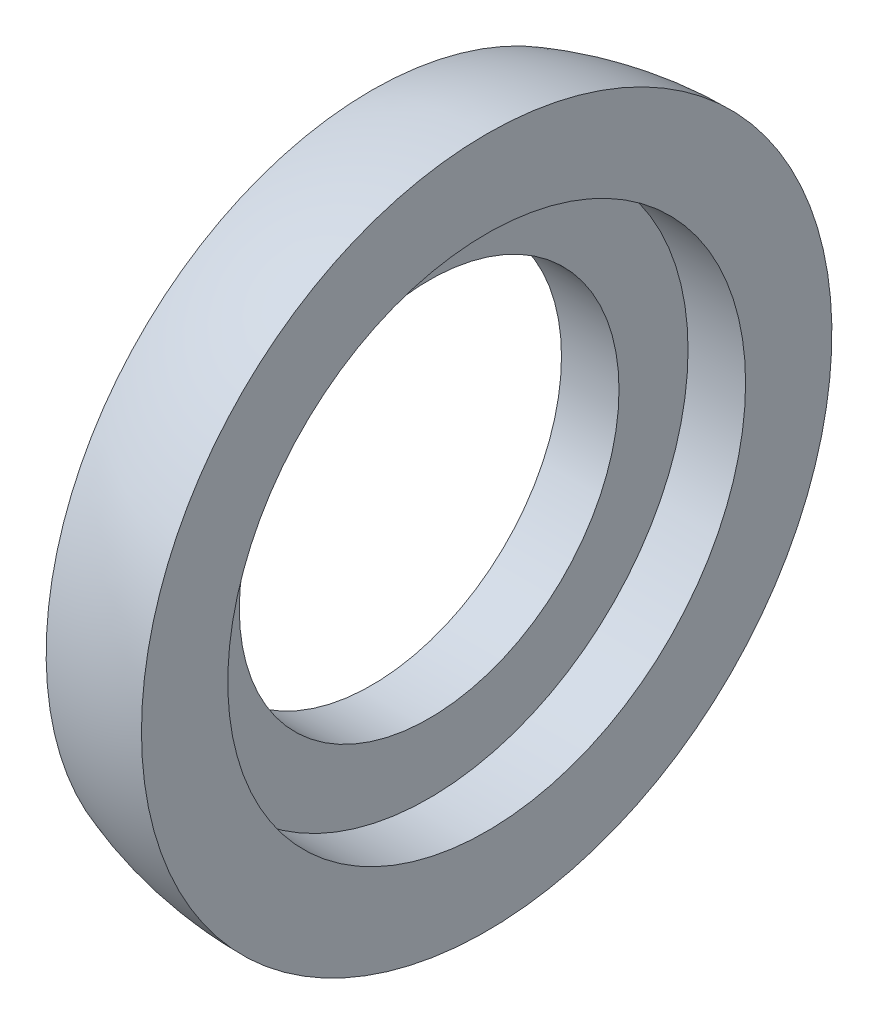
ISO-10303-21;
HEADER;
FILE_DESCRIPTION(('STEP AP214'),'2;1');
FILE_NAME('part.step','',(''),(''),'','','');
FILE_SCHEMA(('AUTOMOTIVE_DESIGN { 1 0 10303 214 1 1 1 1 }'));
ENDSEC;
DATA;
#1=APPLICATION_CONTEXT('core data for automotive mechanical design processes');
#2=APPLICATION_PROTOCOL_DEFINITION('international standard','automotive_design',2000,#1);
#3=PRODUCT_CONTEXT('',#1,'mechanical');
#4=PRODUCT('Part','Part','',(#3));
#5=PRODUCT_RELATED_PRODUCT_CATEGORY('part','',(#4));
#6=PRODUCT_DEFINITION_FORMATION('','',#4);
#7=PRODUCT_DEFINITION_CONTEXT('part definition',#1,'design');
#8=PRODUCT_DEFINITION('design','',#6,#7);
#9=PRODUCT_DEFINITION_SHAPE('','',#8);
#10=(LENGTH_UNIT() NAMED_UNIT(*) SI_UNIT(.MILLI.,.METRE.));
#11=(NAMED_UNIT(*) PLANE_ANGLE_UNIT() SI_UNIT($,.RADIAN.));
#12=(NAMED_UNIT(*) SI_UNIT($,.STERADIAN.) SOLID_ANGLE_UNIT());
#13=UNCERTAINTY_MEASURE_WITH_UNIT(LENGTH_MEASURE(1.E-05),#10,'distance_accuracy_value','');
#14=(GEOMETRIC_REPRESENTATION_CONTEXT(3) GLOBAL_UNCERTAINTY_ASSIGNED_CONTEXT((#13)) GLOBAL_UNIT_ASSIGNED_CONTEXT((#10,
#11,#12)) REPRESENTATION_CONTEXT('',''));
#15=CARTESIAN_POINT('',(0.,0.,0.));
#16=DIRECTION('',(0.,0.,1.));
#17=DIRECTION('',(1.,0.,0.));
#18=AXIS2_PLACEMENT_3D('',#15,#16,#17);
#19=CARTESIAN_POINT('',(-4.,0.,0.));
#20=DIRECTION('',(1.,0.,0.));
#21=DIRECTION('',(0.,0.,-1.));
#22=AXIS2_PLACEMENT_3D('',#19,#20,#21);
#23=CYLINDRICAL_SURFACE('',#22,6.6);
#24=CARTESIAN_POINT('',(-4.,0.,0.));
#25=DIRECTION('',(1.,0.,0.));
#26=DIRECTION('',(0.,0.,-1.));
#27=AXIS2_PLACEMENT_3D('',#24,#25,#26);
#28=CIRCLE('',#27,6.6);
#29=CARTESIAN_POINT('',(-4.,0.,-6.6));
#30=VERTEX_POINT('',#29);
#31=EDGE_CURVE('E64',#30,#30,#28,.T.);
#32=ORIENTED_EDGE('',*,*,#31,.F.);
#33=EDGE_LOOP('',(#32));
#34=FACE_BOUND('',#33,.T.);
#35=CARTESIAN_POINT('',(-2.,0.,0.));
#36=DIRECTION('',(1.,0.,0.));
#37=DIRECTION('',(0.,0.,-1.));
#38=AXIS2_PLACEMENT_3D('',#35,#36,#37);
#39=CIRCLE('',#38,6.6);
#40=CARTESIAN_POINT('',(-2.,0.,-6.6));
#41=VERTEX_POINT('',#40);
#42=EDGE_CURVE('E51',#41,#41,#39,.F.);
#43=ORIENTED_EDGE('',*,*,#42,.F.);
#44=EDGE_LOOP('',(#43));
#45=FACE_BOUND('',#44,.T.);
#46=ADVANCED_FACE('F47',(#34,#45),#23,.F.);
#47=CARTESIAN_POINT('',(0.,0.,0.));
#48=DIRECTION('',(0.,1.,0.));
#49=DIRECTION('',(0.,0.,1.));
#50=AXIS2_PLACEMENT_3D('',#47,#48,#49);
#51=SPHERICAL_SURFACE('',#50,12.);
#52=CARTESIAN_POINT('',(0.,0.,0.));
#53=DIRECTION('',(1.,0.,0.));
#54=DIRECTION('',(0.,1.,0.));
#55=AXIS2_PLACEMENT_3D('',#52,#53,#54);
#56=SPHERICAL_SURFACE('',#55,12.);
#57=CARTESIAN_POINT('',(-4.,0.,0.));
#58=DIRECTION('',(1.,0.,0.));
#59=DIRECTION('',(0.,1.,0.));
#60=AXIS2_PLACEMENT_3D('',#57,#58,#59);
#61=CIRCLE('',#60,11.3137084989848);
#62=CARTESIAN_POINT('',(-4.,11.3137084989848,0.));
#63=VERTEX_POINT('',#62);
#64=EDGE_CURVE('E56',#63,#63,#61,.F.);
#65=ORIENTED_EDGE('',*,*,#64,.F.);
#66=EDGE_LOOP('',(#65));
#67=FACE_BOUND('',#66,.T.);
#68=CARTESIAN_POINT('',(0.,0.,0.));
#69=DIRECTION('',(-1.,0.,0.));
#70=DIRECTION('',(0.,0.,1.));
#71=AXIS2_PLACEMENT_3D('',#68,#69,#70);
#72=CIRCLE('',#71,12.);
#73=CARTESIAN_POINT('',(0.,0.,12.));
#74=VERTEX_POINT('',#73);
#75=EDGE_CURVE('E10',#74,#74,#72,.T.);
#76=ORIENTED_EDGE('',*,*,#75,.T.);
#77=EDGE_LOOP('',(#76));
#78=FACE_BOUND('',#77,.T.);
#79=ADVANCED_FACE('F49',(#67,#78),#56,.T.);
#80=CARTESIAN_POINT('',(0.,0.,0.));
#81=DIRECTION('',(-1.,0.,0.));
#82=DIRECTION('',(0.,0.,1.));
#83=AXIS2_PLACEMENT_3D('',#80,#81,#82);
#84=PLANE('',#83);
#85=CARTESIAN_POINT('',(0.,0.,0.));
#86=DIRECTION('',(1.,0.,0.));
#87=DIRECTION('',(0.,0.,-1.));
#88=AXIS2_PLACEMENT_3D('',#85,#86,#87);
#89=CIRCLE('',#88,9.);
#90=CARTESIAN_POINT('',(0.,0.,-9.));
#91=VERTEX_POINT('',#90);
#92=EDGE_CURVE('E69',#91,#91,#89,.T.);
#93=ORIENTED_EDGE('',*,*,#92,.F.);
#94=EDGE_LOOP('',(#93));
#95=FACE_BOUND('',#94,.T.);
#96=ORIENTED_EDGE('',*,*,#75,.F.);
#97=EDGE_LOOP('',(#96));
#98=FACE_BOUND('',#97,.T.);
#99=ADVANCED_FACE('F90',(#95,#98),#84,.F.);
#100=CARTESIAN_POINT('',(-4.,15.7751920367256,-12.));
#101=DIRECTION('',(1.,0.,0.));
#102=DIRECTION('',(0.,1.,0.));
#103=AXIS2_PLACEMENT_3D('',#100,#101,#102);
#104=PLANE('',#103);
#105=ORIENTED_EDGE('',*,*,#31,.T.);
#106=EDGE_LOOP('',(#105));
#107=FACE_BOUND('',#106,.T.);
#108=ORIENTED_EDGE('',*,*,#64,.T.);
#109=EDGE_LOOP('',(#108));
#110=FACE_BOUND('',#109,.T.);
#111=ADVANCED_FACE('F97',(#107,#110),#104,.F.);
#112=CARTESIAN_POINT('',(-2.,0.,0.));
#113=DIRECTION('',(1.,0.,0.));
#114=DIRECTION('',(0.,0.,-1.));
#115=AXIS2_PLACEMENT_3D('',#112,#113,#114);
#116=PLANE('',#115);
#117=CARTESIAN_POINT('',(-2.,0.,0.));
#118=DIRECTION('',(1.,0.,0.));
#119=DIRECTION('',(0.,0.,-1.));
#120=AXIS2_PLACEMENT_3D('',#117,#118,#119);
#121=CIRCLE('',#120,9.);
#122=CARTESIAN_POINT('',(-2.,0.,-9.));
#123=VERTEX_POINT('',#122);
#124=EDGE_CURVE('E73',#123,#123,#121,.T.);
#125=ORIENTED_EDGE('',*,*,#124,.T.);
#126=EDGE_LOOP('',(#125));
#127=FACE_BOUND('',#126,.T.);
#128=ORIENTED_EDGE('',*,*,#42,.T.);
#129=EDGE_LOOP('',(#128));
#130=FACE_BOUND('',#129,.T.);
#131=ADVANCED_FACE('F83',(#127,#130),#116,.T.);
#132=CARTESIAN_POINT('',(-2.,0.,0.));
#133=DIRECTION('',(1.,0.,0.));
#134=DIRECTION('',(0.,0.,-1.));
#135=AXIS2_PLACEMENT_3D('',#132,#133,#134);
#136=CYLINDRICAL_SURFACE('',#135,9.);
#137=ORIENTED_EDGE('',*,*,#124,.F.);
#138=EDGE_LOOP('',(#137));
#139=FACE_BOUND('',#138,.T.);
#140=ORIENTED_EDGE('',*,*,#92,.T.);
#141=EDGE_LOOP('',(#140));
#142=FACE_BOUND('',#141,.T.);
#143=ADVANCED_FACE('F95',(#139,#142),#136,.F.);
#144=CLOSED_SHELL('',(#46,#79,#99,#111,#131,#143));
#145=MANIFOLD_SOLID_BREP('B2',#144);
#146=ADVANCED_BREP_SHAPE_REPRESENTATION('',(#18,#145),#14);
#147=SHAPE_DEFINITION_REPRESENTATION(#9,#146);
ENDSEC;
END-ISO-10303-21;
